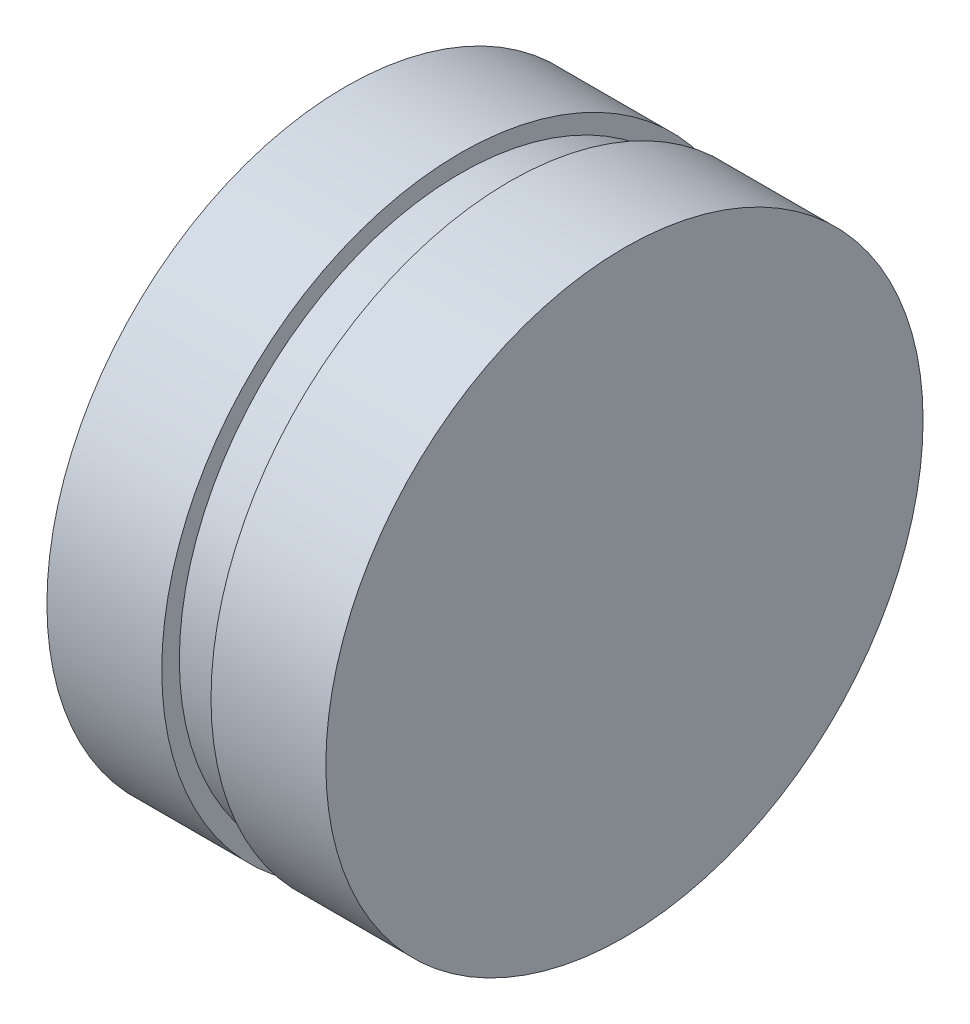
ISO-10303-21;
HEADER;
FILE_DESCRIPTION(('STEP AP214'),'2;1');
FILE_NAME('part.step','',(''),(''),'','','');
FILE_SCHEMA(('AUTOMOTIVE_DESIGN { 1 0 10303 214 1 1 1 1 }'));
ENDSEC;
DATA;
#1=APPLICATION_CONTEXT('core data for automotive mechanical design processes');
#2=APPLICATION_PROTOCOL_DEFINITION('international standard','automotive_design',2000,#1);
#3=PRODUCT_CONTEXT('',#1,'mechanical');
#4=PRODUCT('Part','Part','',(#3));
#5=PRODUCT_RELATED_PRODUCT_CATEGORY('part','',(#4));
#6=PRODUCT_DEFINITION_FORMATION('','',#4);
#7=PRODUCT_DEFINITION_CONTEXT('part definition',#1,'design');
#8=PRODUCT_DEFINITION('design','',#6,#7);
#9=PRODUCT_DEFINITION_SHAPE('','',#8);
#10=(LENGTH_UNIT() NAMED_UNIT(*) SI_UNIT(.MILLI.,.METRE.));
#11=(NAMED_UNIT(*) PLANE_ANGLE_UNIT() SI_UNIT($,.RADIAN.));
#12=(NAMED_UNIT(*) SI_UNIT($,.STERADIAN.) SOLID_ANGLE_UNIT());
#13=UNCERTAINTY_MEASURE_WITH_UNIT(LENGTH_MEASURE(1.E-05),#10,'distance_accuracy_value','');
#14=(GEOMETRIC_REPRESENTATION_CONTEXT(3) GLOBAL_UNCERTAINTY_ASSIGNED_CONTEXT((#13)) GLOBAL_UNIT_ASSIGNED_CONTEXT((#10,
#11,#12)) REPRESENTATION_CONTEXT('',''));
#15=CARTESIAN_POINT('',(0.,0.,0.));
#16=DIRECTION('',(0.,0.,1.));
#17=DIRECTION('',(1.,0.,0.));
#18=AXIS2_PLACEMENT_3D('',#15,#16,#17);
#19=CARTESIAN_POINT('',(56.9722,0.,0.));
#20=DIRECTION('',(-1.,0.,0.));
#21=DIRECTION('',(0.,0.,1.));
#22=AXIS2_PLACEMENT_3D('',#19,#20,#21);
#23=CYLINDRICAL_SURFACE('',#22,21.5646);
#24=CARTESIAN_POINT('',(36.83,0.,0.));
#25=DIRECTION('',(1.,0.,0.));
#26=DIRECTION('',(0.,0.,-1.));
#27=AXIS2_PLACEMENT_3D('',#24,#25,#26);
#28=CIRCLE('',#27,21.5646);
#29=CARTESIAN_POINT('',(36.83,0.,-21.5646));
#30=VERTEX_POINT('',#29);
#31=EDGE_CURVE('E36',#30,#30,#28,.T.);
#32=ORIENTED_EDGE('',*,*,#31,.T.);
#33=EDGE_LOOP('',(#32));
#34=FACE_BOUND('',#33,.T.);
#35=CARTESIAN_POINT('',(45.1231,0.,0.));
#36=DIRECTION('',(-1.,0.,0.));
#37=DIRECTION('',(0.,0.,1.));
#38=AXIS2_PLACEMENT_3D('',#35,#36,#37);
#39=CIRCLE('',#38,21.5646);
#40=CARTESIAN_POINT('',(45.1231,0.,21.5646));
#41=VERTEX_POINT('',#40);
#42=EDGE_CURVE('E53',#41,#41,#39,.T.);
#43=ORIENTED_EDGE('',*,*,#42,.T.);
#44=EDGE_LOOP('',(#43));
#45=FACE_BOUND('',#44,.T.);
#46=ADVANCED_FACE('F33',(#34,#45),#23,.T.);
#47=CARTESIAN_POINT('',(36.83,0.,0.));
#48=DIRECTION('',(1.,0.,0.));
#49=DIRECTION('',(0.,0.,-1.));
#50=AXIS2_PLACEMENT_3D('',#47,#48,#49);
#51=PLANE('',#50);
#52=ORIENTED_EDGE('',*,*,#31,.F.);
#53=EDGE_LOOP('',(#52));
#54=FACE_BOUND('',#53,.T.);
#55=ADVANCED_FACE('F61',(#54),#51,.F.);
#56=CARTESIAN_POINT('',(45.1231,21.5646,0.));
#57=DIRECTION('',(1.,0.,0.));
#58=DIRECTION('',(0.,0.,-1.));
#59=AXIS2_PLACEMENT_3D('',#56,#57,#58);
#60=PLANE('',#59);
#61=CARTESIAN_POINT('',(45.1231,0.,0.));
#62=DIRECTION('',(-1.,0.,0.));
#63=DIRECTION('',(0.,0.,1.));
#64=AXIS2_PLACEMENT_3D('',#61,#62,#63);
#65=CIRCLE('',#64,20.2946);
#66=CARTESIAN_POINT('',(45.1231,0.,20.2946));
#67=VERTEX_POINT('',#66);
#68=EDGE_CURVE('E43',#67,#67,#65,.T.);
#69=ORIENTED_EDGE('',*,*,#68,.T.);
#70=EDGE_LOOP('',(#69));
#71=FACE_BOUND('',#70,.T.);
#72=ORIENTED_EDGE('',*,*,#42,.F.);
#73=EDGE_LOOP('',(#72));
#74=FACE_BOUND('',#73,.T.);
#75=ADVANCED_FACE('F58',(#71,#74),#60,.T.);
#76=CARTESIAN_POINT('',(-14.4069937020437,0.,0.));
#77=DIRECTION('',(-1.,0.,0.));
#78=DIRECTION('',(0.,0.,1.));
#79=AXIS2_PLACEMENT_3D('',#76,#77,#78);
#80=CYLINDRICAL_SURFACE('',#79,20.2946);
#81=CARTESIAN_POINT('',(48.6791,0.,0.));
#82=DIRECTION('',(-1.,0.,0.));
#83=DIRECTION('',(0.,0.,1.));
#84=AXIS2_PLACEMENT_3D('',#81,#82,#83);
#85=CIRCLE('',#84,20.2946);
#86=CARTESIAN_POINT('',(48.6791,0.,20.2946));
#87=VERTEX_POINT('',#86);
#88=EDGE_CURVE('E47',#87,#87,#85,.T.);
#89=ORIENTED_EDGE('',*,*,#88,.T.);
#90=EDGE_LOOP('',(#89));
#91=FACE_BOUND('',#90,.T.);
#92=ORIENTED_EDGE('',*,*,#68,.F.);
#93=EDGE_LOOP('',(#92));
#94=FACE_BOUND('',#93,.T.);
#95=ADVANCED_FACE('F60',(#91,#94),#80,.T.);
#96=CARTESIAN_POINT('',(48.6791,21.5646,0.));
#97=DIRECTION('',(-1.,0.,0.));
#98=DIRECTION('',(0.,0.,1.));
#99=AXIS2_PLACEMENT_3D('',#96,#97,#98);
#100=PLANE('',#99);
#101=CARTESIAN_POINT('',(48.6791,0.,0.));
#102=DIRECTION('',(-1.,0.,0.));
#103=DIRECTION('',(0.,0.,1.));
#104=AXIS2_PLACEMENT_3D('',#101,#102,#103);
#105=CIRCLE('',#104,21.5646);
#106=CARTESIAN_POINT('',(48.6791,0.,21.5646));
#107=VERTEX_POINT('',#106);
#108=EDGE_CURVE('E50',#107,#107,#105,.T.);
#109=ORIENTED_EDGE('',*,*,#108,.T.);
#110=EDGE_LOOP('',(#109));
#111=FACE_BOUND('',#110,.T.);
#112=ORIENTED_EDGE('',*,*,#88,.F.);
#113=EDGE_LOOP('',(#112));
#114=FACE_BOUND('',#113,.T.);
#115=ADVANCED_FACE('F68',(#111,#114),#100,.T.);
#116=CARTESIAN_POINT('',(56.9722,0.,0.));
#117=DIRECTION('',(1.,0.,0.));
#118=DIRECTION('',(0.,0.,-1.));
#119=AXIS2_PLACEMENT_3D('',#116,#117,#118);
#120=PLANE('',#119);
#121=CARTESIAN_POINT('',(56.9722,0.,0.));
#122=DIRECTION('',(1.,0.,0.));
#123=DIRECTION('',(0.,0.,-1.));
#124=AXIS2_PLACEMENT_3D('',#121,#122,#123);
#125=CIRCLE('',#124,21.5646);
#126=CARTESIAN_POINT('',(56.9722,0.,-21.5646));
#127=VERTEX_POINT('',#126);
#128=EDGE_CURVE('E10',#127,#127,#125,.T.);
#129=ORIENTED_EDGE('',*,*,#128,.T.);
#130=EDGE_LOOP('',(#129));
#131=FACE_BOUND('',#130,.T.);
#132=ADVANCED_FACE('F79',(#131),#120,.T.);
#133=ORIENTED_EDGE('',*,*,#128,.F.);
#134=EDGE_LOOP('',(#133));
#135=FACE_BOUND('',#134,.T.);
#136=ORIENTED_EDGE('',*,*,#108,.F.);
#137=EDGE_LOOP('',(#136));
#138=FACE_BOUND('',#137,.T.);
#139=ADVANCED_FACE('F75',(#135,#138),#23,.T.);
#140=CLOSED_SHELL('',(#46,#55,#75,#95,#115,#132,#139));
#141=MANIFOLD_SOLID_BREP('B2',#140);
#142=ADVANCED_BREP_SHAPE_REPRESENTATION('',(#18,#141),#14);
#143=SHAPE_DEFINITION_REPRESENTATION(#9,#142);
ENDSEC;
END-ISO-10303-21;
